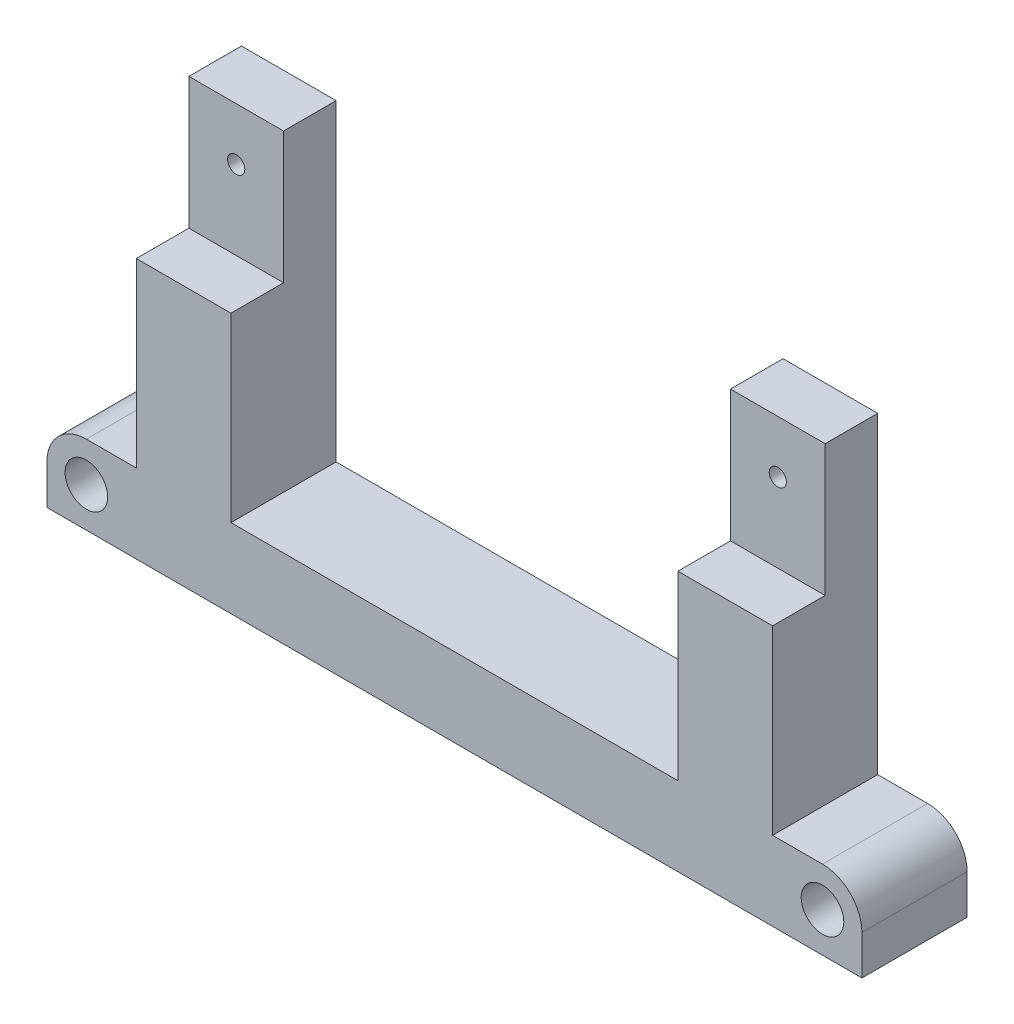
ISO-10303-21;
HEADER;
FILE_DESCRIPTION(('STEP AP214'),'2;1');
FILE_NAME('part.step','',(''),(''),'','','');
FILE_SCHEMA(('AUTOMOTIVE_DESIGN { 1 0 10303 214 1 1 1 1 }'));
ENDSEC;
DATA;
#1=APPLICATION_CONTEXT('core data for automotive mechanical design processes');
#2=APPLICATION_PROTOCOL_DEFINITION('international standard','automotive_design',2000,#1);
#3=PRODUCT_CONTEXT('',#1,'mechanical');
#4=PRODUCT('Part','Part','',(#3));
#5=PRODUCT_RELATED_PRODUCT_CATEGORY('part','',(#4));
#6=PRODUCT_DEFINITION_FORMATION('','',#4);
#7=PRODUCT_DEFINITION_CONTEXT('part definition',#1,'design');
#8=PRODUCT_DEFINITION('design','',#6,#7);
#9=PRODUCT_DEFINITION_SHAPE('','',#8);
#10=(LENGTH_UNIT() NAMED_UNIT(*) SI_UNIT(.MILLI.,.METRE.));
#11=(NAMED_UNIT(*) PLANE_ANGLE_UNIT() SI_UNIT($,.RADIAN.));
#12=(NAMED_UNIT(*) SI_UNIT($,.STERADIAN.) SOLID_ANGLE_UNIT());
#13=UNCERTAINTY_MEASURE_WITH_UNIT(LENGTH_MEASURE(1.E-05),#10,'distance_accuracy_value','');
#14=(GEOMETRIC_REPRESENTATION_CONTEXT(3) GLOBAL_UNCERTAINTY_ASSIGNED_CONTEXT((#13)) GLOBAL_UNIT_ASSIGNED_CONTEXT((#10,
#11,#12)) REPRESENTATION_CONTEXT('',''));
#15=CARTESIAN_POINT('',(0.,0.,0.));
#16=DIRECTION('',(0.,0.,1.));
#17=DIRECTION('',(1.,0.,0.));
#18=AXIS2_PLACEMENT_3D('',#15,#16,#17);
#19=CARTESIAN_POINT('',(-60.5,49.5,10.));
#20=DIRECTION('',(0.,-1.,0.));
#21=DIRECTION('',(1.,0.,0.));
#22=AXIS2_PLACEMENT_3D('',#19,#20,#21);
#23=PLANE('',#22);
#24=DIRECTION('',(1.,0.,0.));
#25=VECTOR('',#24,1.);
#26=CARTESIAN_POINT('',(-60.5,49.5,0.));
#27=LINE('',#26,#25);
#28=CARTESIAN_POINT('',(-60.5,49.5,0.));
#29=VERTEX_POINT('',#28);
#30=CARTESIAN_POINT('',(-42.5,49.5,0.));
#31=VERTEX_POINT('',#30);
#32=EDGE_CURVE('E308',#29,#31,#27,.T.);
#33=ORIENTED_EDGE('',*,*,#32,.F.);
#34=DIRECTION('',(0.,0.,-1.));
#35=VECTOR('',#34,1.);
#36=CARTESIAN_POINT('',(-60.5,49.5,10.));
#37=LINE('',#36,#35);
#38=CARTESIAN_POINT('',(-60.5,49.5,10.));
#39=VERTEX_POINT('',#38);
#40=EDGE_CURVE('E160',#39,#29,#37,.T.);
#41=ORIENTED_EDGE('',*,*,#40,.F.);
#42=DIRECTION('',(-1.,0.,0.));
#43=VECTOR('',#42,1.);
#44=CARTESIAN_POINT('',(-60.5,49.5,10.));
#45=LINE('',#44,#43);
#46=CARTESIAN_POINT('',(-42.5,49.5,10.));
#47=VERTEX_POINT('',#46);
#48=EDGE_CURVE('E148',#47,#39,#45,.T.);
#49=ORIENTED_EDGE('',*,*,#48,.F.);
#50=DIRECTION('',(0.,0.,-1.));
#51=VECTOR('',#50,1.);
#52=CARTESIAN_POINT('',(-42.5,49.5,10.));
#53=LINE('',#52,#51);
#54=EDGE_CURVE('E215',#47,#31,#53,.T.);
#55=ORIENTED_EDGE('',*,*,#54,.T.);
#56=EDGE_LOOP('',(#33,#41,#49,#55));
#57=FACE_BOUND('',#56,.T.);
#58=ADVANCED_FACE('F39',(#57),#23,.F.);
#59=CARTESIAN_POINT('',(42.5,49.5,10.));
#60=DIRECTION('',(0.,-1.,0.));
#61=DIRECTION('',(1.,0.,0.));
#62=AXIS2_PLACEMENT_3D('',#59,#60,#61);
#63=PLANE('',#62);
#64=DIRECTION('',(1.,0.,0.));
#65=VECTOR('',#64,1.);
#66=CARTESIAN_POINT('',(42.5,49.5,0.));
#67=LINE('',#66,#65);
#68=CARTESIAN_POINT('',(42.5,49.5,0.));
#69=VERTEX_POINT('',#68);
#70=CARTESIAN_POINT('',(60.5,49.5,0.));
#71=VERTEX_POINT('',#70);
#72=EDGE_CURVE('E372',#69,#71,#67,.T.);
#73=ORIENTED_EDGE('',*,*,#72,.F.);
#74=DIRECTION('',(0.,0.,-1.));
#75=VECTOR('',#74,1.);
#76=CARTESIAN_POINT('',(42.5,49.5,10.));
#77=LINE('',#76,#75);
#78=CARTESIAN_POINT('',(42.5,49.5,10.));
#79=VERTEX_POINT('',#78);
#80=EDGE_CURVE('E227',#79,#69,#77,.T.);
#81=ORIENTED_EDGE('',*,*,#80,.F.);
#82=DIRECTION('',(-1.,0.,0.));
#83=VECTOR('',#82,1.);
#84=CARTESIAN_POINT('',(42.5,49.5,10.));
#85=LINE('',#84,#83);
#86=CARTESIAN_POINT('',(60.5,49.5,10.));
#87=VERTEX_POINT('',#86);
#88=EDGE_CURVE('E277',#87,#79,#85,.T.);
#89=ORIENTED_EDGE('',*,*,#88,.F.);
#90=DIRECTION('',(0.,0.,-1.));
#91=VECTOR('',#90,1.);
#92=CARTESIAN_POINT('',(60.5,49.5,10.));
#93=LINE('',#92,#91);
#94=EDGE_CURVE('E231',#87,#71,#93,.T.);
#95=ORIENTED_EDGE('',*,*,#94,.T.);
#96=EDGE_LOOP('',(#73,#81,#89,#95));
#97=FACE_BOUND('',#96,.T.);
#98=ADVANCED_FACE('F426',(#97),#63,.F.);
#99=CARTESIAN_POINT('',(-70.,7.5,10.));
#100=DIRECTION('',(0.,0.,-1.));
#101=DIRECTION('',(-1.,0.,0.));
#102=AXIS2_PLACEMENT_3D('',#99,#100,#101);
#103=PLANE('',#102);
#104=DIRECTION('',(0.,-1.,0.));
#105=VECTOR('',#104,1.);
#106=CARTESIAN_POINT('',(-77.5,0.,10.));
#107=LINE('',#106,#105);
#108=CARTESIAN_POINT('',(-77.5,7.5,10.));
#109=VERTEX_POINT('',#108);
#110=CARTESIAN_POINT('',(-77.5,0.,10.));
#111=VERTEX_POINT('',#110);
#112=EDGE_CURVE('E208',#109,#111,#107,.T.);
#113=ORIENTED_EDGE('',*,*,#112,.T.);
#114=DIRECTION('',(1.,0.,0.));
#115=VECTOR('',#114,1.);
#116=CARTESIAN_POINT('',(-77.5,0.,10.));
#117=LINE('',#116,#115);
#118=CARTESIAN_POINT('',(77.5,0.,10.));
#119=VERTEX_POINT('',#118);
#120=EDGE_CURVE('E107',#111,#119,#117,.T.);
#121=ORIENTED_EDGE('',*,*,#120,.T.);
#122=DIRECTION('',(0.,1.,0.));
#123=VECTOR('',#122,1.);
#124=CARTESIAN_POINT('',(77.5,7.50000000000003,10.));
#125=LINE('',#124,#123);
#126=CARTESIAN_POINT('',(77.5,7.50000000000003,10.));
#127=VERTEX_POINT('',#126);
#128=EDGE_CURVE('E253',#119,#127,#125,.T.);
#129=ORIENTED_EDGE('',*,*,#128,.T.);
#130=CARTESIAN_POINT('',(70.,7.5,10.));
#131=DIRECTION('',(0.,0.,1.));
#132=DIRECTION('',(-1.,0.,0.));
#133=AXIS2_PLACEMENT_3D('',#130,#131,#132);
#134=CIRCLE('',#133,7.50000000000001);
#135=CARTESIAN_POINT('',(70.,15.,10.));
#136=VERTEX_POINT('',#135);
#137=EDGE_CURVE('E273',#127,#136,#134,.T.);
#138=ORIENTED_EDGE('',*,*,#137,.T.);
#139=DIRECTION('',(-1.,0.,0.));
#140=VECTOR('',#139,1.);
#141=CARTESIAN_POINT('',(60.5,15.,10.));
#142=LINE('',#141,#140);
#143=CARTESIAN_POINT('',(60.5,15.,10.));
#144=VERTEX_POINT('',#143);
#145=EDGE_CURVE('E269',#136,#144,#142,.T.);
#146=ORIENTED_EDGE('',*,*,#145,.T.);
#147=DIRECTION('',(0.,1.,0.));
#148=VECTOR('',#147,1.);
#149=CARTESIAN_POINT('',(60.5,49.5,10.));
#150=LINE('',#149,#148);
#151=EDGE_CURVE('E272',#144,#87,#150,.T.);
#152=ORIENTED_EDGE('',*,*,#151,.T.);
#153=ORIENTED_EDGE('',*,*,#88,.T.);
#154=DIRECTION('',(0.,-1.,0.));
#155=VECTOR('',#154,1.);
#156=CARTESIAN_POINT('',(42.5,15.,10.));
#157=LINE('',#156,#155);
#158=CARTESIAN_POINT('',(42.5,15.,10.));
#159=VERTEX_POINT('',#158);
#160=EDGE_CURVE('E284',#79,#159,#157,.T.);
#161=ORIENTED_EDGE('',*,*,#160,.T.);
#162=DIRECTION('',(-1.,0.,0.));
#163=VECTOR('',#162,1.);
#164=CARTESIAN_POINT('',(-42.5,15.,10.));
#165=LINE('',#164,#163);
#166=CARTESIAN_POINT('',(-42.5,15.,10.));
#167=VERTEX_POINT('',#166);
#168=EDGE_CURVE('E287',#159,#167,#165,.T.);
#169=ORIENTED_EDGE('',*,*,#168,.T.);
#170=DIRECTION('',(0.,1.,0.));
#171=VECTOR('',#170,1.);
#172=CARTESIAN_POINT('',(-42.5,49.5,10.));
#173=LINE('',#172,#171);
#174=EDGE_CURVE('E290',#167,#47,#173,.T.);
#175=ORIENTED_EDGE('',*,*,#174,.T.);
#176=ORIENTED_EDGE('',*,*,#48,.T.);
#177=DIRECTION('',(0.,-1.,0.));
#178=VECTOR('',#177,1.);
#179=CARTESIAN_POINT('',(-60.5,15.,10.));
#180=LINE('',#179,#178);
#181=CARTESIAN_POINT('',(-60.5,15.,10.));
#182=VERTEX_POINT('',#181);
#183=EDGE_CURVE('E141',#39,#182,#180,.T.);
#184=ORIENTED_EDGE('',*,*,#183,.T.);
#185=DIRECTION('',(-1.,0.,0.));
#186=VECTOR('',#185,1.);
#187=CARTESIAN_POINT('',(-70.,15.,10.));
#188=LINE('',#187,#186);
#189=CARTESIAN_POINT('',(-70.,15.,10.));
#190=VERTEX_POINT('',#189);
#191=EDGE_CURVE('E146',#182,#190,#188,.T.);
#192=ORIENTED_EDGE('',*,*,#191,.T.);
#193=CARTESIAN_POINT('',(-70.,7.5,10.));
#194=DIRECTION('',(0.,0.,1.));
#195=DIRECTION('',(-1.,0.,0.));
#196=AXIS2_PLACEMENT_3D('',#193,#194,#195);
#197=CIRCLE('',#196,7.5);
#198=EDGE_CURVE('E57',#190,#109,#197,.T.);
#199=ORIENTED_EDGE('',*,*,#198,.T.);
#200=EDGE_LOOP('',(#113,#121,#129,#138,#146,#152,#153,#161,#169,#175,#176,#184,#192,#199));
#201=FACE_BOUND('',#200,.T.);
#202=CARTESIAN_POINT('',(-70.,7.5,10.));
#203=DIRECTION('',(0.,0.,1.));
#204=DIRECTION('',(1.,0.,0.));
#205=AXIS2_PLACEMENT_3D('',#202,#203,#204);
#206=CIRCLE('',#205,4.05);
#207=CARTESIAN_POINT('',(-65.95,7.5,10.));
#208=VERTEX_POINT('',#207);
#209=EDGE_CURVE('E176',#208,#208,#206,.T.);
#210=ORIENTED_EDGE('',*,*,#209,.F.);
#211=EDGE_LOOP('',(#210));
#212=FACE_BOUND('',#211,.T.);
#213=CARTESIAN_POINT('',(70.,7.5,10.));
#214=DIRECTION('',(0.,0.,1.));
#215=DIRECTION('',(1.,0.,0.));
#216=AXIS2_PLACEMENT_3D('',#213,#214,#215);
#217=CIRCLE('',#216,4.05);
#218=CARTESIAN_POINT('',(74.05,7.5,10.));
#219=VERTEX_POINT('',#218);
#220=EDGE_CURVE('E397',#219,#219,#217,.T.);
#221=ORIENTED_EDGE('',*,*,#220,.F.);
#222=EDGE_LOOP('',(#221));
#223=FACE_BOUND('',#222,.T.);
#224=ADVANCED_FACE('F143',(#201,#212,#223),#103,.F.);
#225=CARTESIAN_POINT('',(-70.,7.5,-10.));
#226=DIRECTION('',(0.,0.,-1.));
#227=DIRECTION('',(-1.,0.,0.));
#228=AXIS2_PLACEMENT_3D('',#225,#226,#227);
#229=PLANE('',#228);
#230=CARTESIAN_POINT('',(-51.5,64.5,-10.));
#231=DIRECTION('',(0.,0.,1.));
#232=DIRECTION('',(1.,0.,0.));
#233=AXIS2_PLACEMENT_3D('',#230,#231,#232);
#234=CIRCLE('',#233,1.63195);
#235=CARTESIAN_POINT('',(-49.86805,64.5,-10.));
#236=VERTEX_POINT('',#235);
#237=EDGE_CURVE('E651',#236,#236,#234,.T.);
#238=ORIENTED_EDGE('',*,*,#237,.T.);
#239=EDGE_LOOP('',(#238));
#240=FACE_BOUND('',#239,.T.);
#241=CARTESIAN_POINT('',(51.5,64.5,-10.));
#242=DIRECTION('',(0.,0.,1.));
#243=DIRECTION('',(1.,0.,0.));
#244=AXIS2_PLACEMENT_3D('',#241,#242,#243);
#245=CIRCLE('',#244,1.63195);
#246=CARTESIAN_POINT('',(53.13195,64.5,-10.));
#247=VERTEX_POINT('',#246);
#248=EDGE_CURVE('E359',#247,#247,#245,.T.);
#249=ORIENTED_EDGE('',*,*,#248,.T.);
#250=EDGE_LOOP('',(#249));
#251=FACE_BOUND('',#250,.T.);
#252=CARTESIAN_POINT('',(-70.,7.5,-10.));
#253=DIRECTION('',(0.,0.,1.));
#254=DIRECTION('',(1.,0.,0.));
#255=AXIS2_PLACEMENT_3D('',#252,#253,#254);
#256=CIRCLE('',#255,4.05);
#257=CARTESIAN_POINT('',(-65.95,7.5,-10.));
#258=VERTEX_POINT('',#257);
#259=EDGE_CURVE('E401',#258,#258,#256,.T.);
#260=ORIENTED_EDGE('',*,*,#259,.T.);
#261=EDGE_LOOP('',(#260));
#262=FACE_BOUND('',#261,.T.);
#263=DIRECTION('',(0.,-1.,0.));
#264=VECTOR('',#263,1.);
#265=CARTESIAN_POINT('',(-77.5,0.,-10.));
#266=LINE('',#265,#264);
#267=CARTESIAN_POINT('',(-77.5,7.5,-10.));
#268=VERTEX_POINT('',#267);
#269=CARTESIAN_POINT('',(-77.5,0.,-10.));
#270=VERTEX_POINT('',#269);
#271=EDGE_CURVE('E171',#268,#270,#266,.T.);
#272=ORIENTED_EDGE('',*,*,#271,.F.);
#273=CARTESIAN_POINT('',(-70.,7.5,-10.));
#274=DIRECTION('',(0.,0.,1.));
#275=DIRECTION('',(-1.,0.,0.));
#276=AXIS2_PLACEMENT_3D('',#273,#274,#275);
#277=CIRCLE('',#276,7.5);
#278=CARTESIAN_POINT('',(-70.,15.,-10.));
#279=VERTEX_POINT('',#278);
#280=EDGE_CURVE('E99',#279,#268,#277,.T.);
#281=ORIENTED_EDGE('',*,*,#280,.F.);
#282=DIRECTION('',(-1.,0.,0.));
#283=VECTOR('',#282,1.);
#284=CARTESIAN_POINT('',(-70.,15.,-10.));
#285=LINE('',#284,#283);
#286=CARTESIAN_POINT('',(-60.5,15.,-10.));
#287=VERTEX_POINT('',#286);
#288=EDGE_CURVE('E93',#287,#279,#285,.T.);
#289=ORIENTED_EDGE('',*,*,#288,.F.);
#290=DIRECTION('',(0.,-1.,0.));
#291=VECTOR('',#290,1.);
#292=CARTESIAN_POINT('',(-60.5,15.,-10.));
#293=LINE('',#292,#291);
#294=CARTESIAN_POINT('',(-60.5,74.5,-10.));
#295=VERTEX_POINT('',#294);
#296=EDGE_CURVE('E158',#295,#287,#293,.T.);
#297=ORIENTED_EDGE('',*,*,#296,.F.);
#298=DIRECTION('',(-1.,0.,0.));
#299=VECTOR('',#298,1.);
#300=CARTESIAN_POINT('',(-60.5,74.5,-10.));
#301=LINE('',#300,#299);
#302=CARTESIAN_POINT('',(-42.5,74.5,-10.));
#303=VERTEX_POINT('',#302);
#304=EDGE_CURVE('E355',#303,#295,#301,.T.);
#305=ORIENTED_EDGE('',*,*,#304,.F.);
#306=DIRECTION('',(0.,1.,0.));
#307=VECTOR('',#306,1.);
#308=CARTESIAN_POINT('',(-42.5,49.5,-10.));
#309=LINE('',#308,#307);
#310=CARTESIAN_POINT('',(-42.5,15.,-10.));
#311=VERTEX_POINT('',#310);
#312=EDGE_CURVE('E198',#311,#303,#309,.T.);
#313=ORIENTED_EDGE('',*,*,#312,.F.);
#314=DIRECTION('',(-1.,0.,0.));
#315=VECTOR('',#314,1.);
#316=CARTESIAN_POINT('',(-42.5,15.,-10.));
#317=LINE('',#316,#315);
#318=CARTESIAN_POINT('',(42.5,15.,-10.));
#319=VERTEX_POINT('',#318);
#320=EDGE_CURVE('E195',#319,#311,#317,.T.);
#321=ORIENTED_EDGE('',*,*,#320,.F.);
#322=DIRECTION('',(0.,-1.,0.));
#323=VECTOR('',#322,1.);
#324=CARTESIAN_POINT('',(42.5,15.,-10.));
#325=LINE('',#324,#323);
#326=CARTESIAN_POINT('',(42.5,74.5,-10.));
#327=VERTEX_POINT('',#326);
#328=EDGE_CURVE('E192',#327,#319,#325,.T.);
#329=ORIENTED_EDGE('',*,*,#328,.F.);
#330=DIRECTION('',(-1.,0.,0.));
#331=VECTOR('',#330,1.);
#332=CARTESIAN_POINT('',(42.5,74.5,-10.));
#333=LINE('',#332,#331);
#334=CARTESIAN_POINT('',(60.5,74.5,-10.));
#335=VERTEX_POINT('',#334);
#336=EDGE_CURVE('E384',#335,#327,#333,.T.);
#337=ORIENTED_EDGE('',*,*,#336,.F.);
#338=DIRECTION('',(0.,1.,0.));
#339=VECTOR('',#338,1.);
#340=CARTESIAN_POINT('',(60.5,49.5,-10.));
#341=LINE('',#340,#339);
#342=CARTESIAN_POINT('',(60.5,15.,-10.));
#343=VERTEX_POINT('',#342);
#344=EDGE_CURVE('E188',#343,#335,#341,.T.);
#345=ORIENTED_EDGE('',*,*,#344,.F.);
#346=DIRECTION('',(-1.,0.,0.));
#347=VECTOR('',#346,1.);
#348=CARTESIAN_POINT('',(60.5,15.,-10.));
#349=LINE('',#348,#347);
#350=CARTESIAN_POINT('',(70.,15.,-10.));
#351=VERTEX_POINT('',#350);
#352=EDGE_CURVE('E185',#351,#343,#349,.T.);
#353=ORIENTED_EDGE('',*,*,#352,.F.);
#354=CARTESIAN_POINT('',(70.,7.5,-10.));
#355=DIRECTION('',(0.,0.,1.));
#356=DIRECTION('',(-1.,0.,0.));
#357=AXIS2_PLACEMENT_3D('',#354,#355,#356);
#358=CIRCLE('',#357,7.50000000000001);
#359=CARTESIAN_POINT('',(77.5,7.50000000000003,-10.));
#360=VERTEX_POINT('',#359);
#361=EDGE_CURVE('E182',#360,#351,#358,.T.);
#362=ORIENTED_EDGE('',*,*,#361,.F.);
#363=DIRECTION('',(0.,1.,0.));
#364=VECTOR('',#363,1.);
#365=CARTESIAN_POINT('',(77.5,7.50000000000003,-10.));
#366=LINE('',#365,#364);
#367=CARTESIAN_POINT('',(77.5,0.,-10.));
#368=VERTEX_POINT('',#367);
#369=EDGE_CURVE('E179',#368,#360,#366,.T.);
#370=ORIENTED_EDGE('',*,*,#369,.F.);
#371=DIRECTION('',(1.,0.,0.));
#372=VECTOR('',#371,1.);
#373=CARTESIAN_POINT('',(-77.5,0.,-10.));
#374=LINE('',#373,#372);
#375=EDGE_CURVE('E175',#270,#368,#374,.T.);
#376=ORIENTED_EDGE('',*,*,#375,.F.);
#377=EDGE_LOOP('',(#272,#281,#289,#297,#305,#313,#321,#329,#337,#345,#353,#362,#370,#376));
#378=FACE_BOUND('',#377,.T.);
#379=CARTESIAN_POINT('',(70.,7.5,-10.));
#380=DIRECTION('',(0.,0.,1.));
#381=DIRECTION('',(1.,0.,0.));
#382=AXIS2_PLACEMENT_3D('',#379,#380,#381);
#383=CIRCLE('',#382,4.05);
#384=CARTESIAN_POINT('',(74.05,7.5,-10.));
#385=VERTEX_POINT('',#384);
#386=EDGE_CURVE('E396',#385,#385,#383,.T.);
#387=ORIENTED_EDGE('',*,*,#386,.T.);
#388=EDGE_LOOP('',(#387));
#389=FACE_BOUND('',#388,.T.);
#390=ADVANCED_FACE('F257',(#240,#251,#262,#378,#389),#229,.T.);
#391=CARTESIAN_POINT('',(-77.5,0.,10.));
#392=DIRECTION('',(1.,0.,0.));
#393=DIRECTION('',(0.,1.,0.));
#394=AXIS2_PLACEMENT_3D('',#391,#392,#393);
#395=PLANE('',#394);
#396=ORIENTED_EDGE('',*,*,#271,.T.);
#397=DIRECTION('',(0.,0.,-1.));
#398=VECTOR('',#397,1.);
#399=CARTESIAN_POINT('',(-77.5,0.,10.));
#400=LINE('',#399,#398);
#401=EDGE_CURVE('E11',#111,#270,#400,.T.);
#402=ORIENTED_EDGE('',*,*,#401,.F.);
#403=ORIENTED_EDGE('',*,*,#112,.F.);
#404=DIRECTION('',(0.,0.,-1.));
#405=VECTOR('',#404,1.);
#406=CARTESIAN_POINT('',(-77.5,7.5,10.));
#407=LINE('',#406,#405);
#408=EDGE_CURVE('E167',#109,#268,#407,.T.);
#409=ORIENTED_EDGE('',*,*,#408,.T.);
#410=EDGE_LOOP('',(#396,#402,#403,#409));
#411=FACE_BOUND('',#410,.T.);
#412=ADVANCED_FACE('F41',(#411),#395,.F.);
#413=CARTESIAN_POINT('',(-77.5,0.,10.));
#414=DIRECTION('',(0.,1.,0.));
#415=DIRECTION('',(-1.,0.,0.));
#416=AXIS2_PLACEMENT_3D('',#413,#414,#415);
#417=PLANE('',#416);
#418=ORIENTED_EDGE('',*,*,#375,.T.);
#419=DIRECTION('',(0.,0.,-1.));
#420=VECTOR('',#419,1.);
#421=CARTESIAN_POINT('',(77.5,0.,10.));
#422=LINE('',#421,#420);
#423=EDGE_CURVE('E49',#119,#368,#422,.T.);
#424=ORIENTED_EDGE('',*,*,#423,.F.);
#425=ORIENTED_EDGE('',*,*,#120,.F.);
#426=ORIENTED_EDGE('',*,*,#401,.T.);
#427=EDGE_LOOP('',(#418,#424,#425,#426));
#428=FACE_BOUND('',#427,.T.);
#429=ADVANCED_FACE('F418',(#428),#417,.F.);
#430=CARTESIAN_POINT('',(77.5,7.50000000000003,10.));
#431=DIRECTION('',(-1.,0.,0.));
#432=DIRECTION('',(0.,-1.,0.));
#433=AXIS2_PLACEMENT_3D('',#430,#431,#432);
#434=PLANE('',#433);
#435=ORIENTED_EDGE('',*,*,#369,.T.);
#436=DIRECTION('',(0.,0.,-1.));
#437=VECTOR('',#436,1.);
#438=CARTESIAN_POINT('',(77.5,7.50000000000003,10.));
#439=LINE('',#438,#437);
#440=EDGE_CURVE('E243',#127,#360,#439,.T.);
#441=ORIENTED_EDGE('',*,*,#440,.F.);
#442=ORIENTED_EDGE('',*,*,#128,.F.);
#443=ORIENTED_EDGE('',*,*,#423,.T.);
#444=EDGE_LOOP('',(#435,#441,#442,#443));
#445=FACE_BOUND('',#444,.T.);
#446=ADVANCED_FACE('F251',(#445),#434,.F.);
#447=CARTESIAN_POINT('',(70.,7.5,10.));
#448=DIRECTION('',(0.,0.,-1.));
#449=DIRECTION('',(-1.,0.,0.));
#450=AXIS2_PLACEMENT_3D('',#447,#448,#449);
#451=CYLINDRICAL_SURFACE('',#450,7.50000000000001);
#452=ORIENTED_EDGE('',*,*,#361,.T.);
#453=DIRECTION('',(0.,0.,-1.));
#454=VECTOR('',#453,1.);
#455=CARTESIAN_POINT('',(70.,15.,10.));
#456=LINE('',#455,#454);
#457=EDGE_CURVE('E239',#136,#351,#456,.T.);
#458=ORIENTED_EDGE('',*,*,#457,.F.);
#459=ORIENTED_EDGE('',*,*,#137,.F.);
#460=ORIENTED_EDGE('',*,*,#440,.T.);
#461=EDGE_LOOP('',(#452,#458,#459,#460));
#462=FACE_BOUND('',#461,.T.);
#463=ADVANCED_FACE('F263',(#462),#451,.T.);
#464=CARTESIAN_POINT('',(60.5,15.,10.));
#465=DIRECTION('',(0.,-1.,0.));
#466=DIRECTION('',(1.,0.,0.));
#467=AXIS2_PLACEMENT_3D('',#464,#465,#466);
#468=PLANE('',#467);
#469=ORIENTED_EDGE('',*,*,#352,.T.);
#470=DIRECTION('',(0.,0.,-1.));
#471=VECTOR('',#470,1.);
#472=CARTESIAN_POINT('',(60.5,15.,10.));
#473=LINE('',#472,#471);
#474=EDGE_CURVE('E235',#144,#343,#473,.T.);
#475=ORIENTED_EDGE('',*,*,#474,.F.);
#476=ORIENTED_EDGE('',*,*,#145,.F.);
#477=ORIENTED_EDGE('',*,*,#457,.T.);
#478=EDGE_LOOP('',(#469,#475,#476,#477));
#479=FACE_BOUND('',#478,.T.);
#480=ADVANCED_FACE('F267',(#479),#468,.F.);
#481=CARTESIAN_POINT('',(60.5,49.5,10.));
#482=DIRECTION('',(-1.,0.,0.));
#483=DIRECTION('',(0.,-1.,0.));
#484=AXIS2_PLACEMENT_3D('',#481,#482,#483);
#485=PLANE('',#484);
#486=ORIENTED_EDGE('',*,*,#344,.T.);
#487=DIRECTION('',(0.,0.,-1.));
#488=VECTOR('',#487,1.);
#489=CARTESIAN_POINT('',(60.5,74.5,-10.));
#490=LINE('',#489,#488);
#491=CARTESIAN_POINT('',(60.5,74.5,0.));
#492=VERTEX_POINT('',#491);
#493=EDGE_CURVE('E380',#492,#335,#490,.T.);
#494=ORIENTED_EDGE('',*,*,#493,.F.);
#495=DIRECTION('',(0.,-1.,0.));
#496=VECTOR('',#495,1.);
#497=CARTESIAN_POINT('',(60.5,74.5,0.));
#498=LINE('',#497,#496);
#499=EDGE_CURVE('E388',#492,#71,#498,.T.);
#500=ORIENTED_EDGE('',*,*,#499,.T.);
#501=ORIENTED_EDGE('',*,*,#94,.F.);
#502=ORIENTED_EDGE('',*,*,#151,.F.);
#503=ORIENTED_EDGE('',*,*,#474,.T.);
#504=EDGE_LOOP('',(#486,#494,#500,#501,#502,#503));
#505=FACE_BOUND('',#504,.T.);
#506=ADVANCED_FACE('F444',(#505),#485,.F.);
#507=CARTESIAN_POINT('',(42.5,15.,10.));
#508=DIRECTION('',(1.,0.,0.));
#509=DIRECTION('',(0.,1.,0.));
#510=AXIS2_PLACEMENT_3D('',#507,#508,#509);
#511=PLANE('',#510);
#512=ORIENTED_EDGE('',*,*,#328,.T.);
#513=DIRECTION('',(0.,0.,-1.));
#514=VECTOR('',#513,1.);
#515=CARTESIAN_POINT('',(42.5,15.,10.));
#516=LINE('',#515,#514);
#517=EDGE_CURVE('E223',#159,#319,#516,.T.);
#518=ORIENTED_EDGE('',*,*,#517,.F.);
#519=ORIENTED_EDGE('',*,*,#160,.F.);
#520=ORIENTED_EDGE('',*,*,#80,.T.);
#521=DIRECTION('',(0.,-1.,0.));
#522=VECTOR('',#521,1.);
#523=CARTESIAN_POINT('',(42.5,74.5,0.));
#524=LINE('',#523,#522);
#525=CARTESIAN_POINT('',(42.5,74.5,0.));
#526=VERTEX_POINT('',#525);
#527=EDGE_CURVE('E335',#526,#69,#524,.T.);
#528=ORIENTED_EDGE('',*,*,#527,.F.);
#529=DIRECTION('',(0.,0.,1.));
#530=VECTOR('',#529,1.);
#531=CARTESIAN_POINT('',(42.5,74.5,-10.));
#532=LINE('',#531,#530);
#533=EDGE_CURVE('E373',#327,#526,#532,.T.);
#534=ORIENTED_EDGE('',*,*,#533,.F.);
#535=EDGE_LOOP('',(#512,#518,#519,#520,#528,#534));
#536=FACE_BOUND('',#535,.T.);
#537=ADVANCED_FACE('F441',(#536),#511,.F.);
#538=CARTESIAN_POINT('',(-42.5,15.,10.));
#539=DIRECTION('',(0.,-1.,0.));
#540=DIRECTION('',(1.,0.,0.));
#541=AXIS2_PLACEMENT_3D('',#538,#539,#540);
#542=PLANE('',#541);
#543=ORIENTED_EDGE('',*,*,#320,.T.);
#544=DIRECTION('',(0.,0.,-1.));
#545=VECTOR('',#544,1.);
#546=CARTESIAN_POINT('',(-42.5,15.,10.));
#547=LINE('',#546,#545);
#548=EDGE_CURVE('E219',#167,#311,#547,.T.);
#549=ORIENTED_EDGE('',*,*,#548,.F.);
#550=ORIENTED_EDGE('',*,*,#168,.F.);
#551=ORIENTED_EDGE('',*,*,#517,.T.);
#552=EDGE_LOOP('',(#543,#549,#550,#551));
#553=FACE_BOUND('',#552,.T.);
#554=ADVANCED_FACE('F438',(#553),#542,.F.);
#555=CARTESIAN_POINT('',(-42.5,49.5,10.));
#556=DIRECTION('',(-1.,0.,0.));
#557=DIRECTION('',(0.,-1.,0.));
#558=AXIS2_PLACEMENT_3D('',#555,#556,#557);
#559=PLANE('',#558);
#560=ORIENTED_EDGE('',*,*,#312,.T.);
#561=DIRECTION('',(0.,0.,-1.));
#562=VECTOR('',#561,1.);
#563=CARTESIAN_POINT('',(-42.5,74.5,-10.));
#564=LINE('',#563,#562);
#565=CARTESIAN_POINT('',(-42.5,74.5,0.));
#566=VERTEX_POINT('',#565);
#567=EDGE_CURVE('E351',#566,#303,#564,.T.);
#568=ORIENTED_EDGE('',*,*,#567,.F.);
#569=DIRECTION('',(0.,-1.,0.));
#570=VECTOR('',#569,1.);
#571=CARTESIAN_POINT('',(-42.5,74.5,0.));
#572=LINE('',#571,#570);
#573=EDGE_CURVE('E303',#566,#31,#572,.T.);
#574=ORIENTED_EDGE('',*,*,#573,.T.);
#575=ORIENTED_EDGE('',*,*,#54,.F.);
#576=ORIENTED_EDGE('',*,*,#174,.F.);
#577=ORIENTED_EDGE('',*,*,#548,.T.);
#578=EDGE_LOOP('',(#560,#568,#574,#575,#576,#577));
#579=FACE_BOUND('',#578,.T.);
#580=ADVANCED_FACE('F299',(#579),#559,.F.);
#581=CARTESIAN_POINT('',(-60.5,15.,10.));
#582=DIRECTION('',(1.,0.,0.));
#583=DIRECTION('',(0.,1.,0.));
#584=AXIS2_PLACEMENT_3D('',#581,#582,#583);
#585=PLANE('',#584);
#586=ORIENTED_EDGE('',*,*,#296,.T.);
#587=DIRECTION('',(0.,0.,-1.));
#588=VECTOR('',#587,1.);
#589=CARTESIAN_POINT('',(-60.5,15.,10.));
#590=LINE('',#589,#588);
#591=EDGE_CURVE('E154',#182,#287,#590,.T.);
#592=ORIENTED_EDGE('',*,*,#591,.F.);
#593=ORIENTED_EDGE('',*,*,#183,.F.);
#594=ORIENTED_EDGE('',*,*,#40,.T.);
#595=DIRECTION('',(0.,-1.,0.));
#596=VECTOR('',#595,1.);
#597=CARTESIAN_POINT('',(-60.5,74.5,0.));
#598=LINE('',#597,#596);
#599=CARTESIAN_POINT('',(-60.5,74.5,0.));
#600=VERTEX_POINT('',#599);
#601=EDGE_CURVE('E312',#600,#29,#598,.T.);
#602=ORIENTED_EDGE('',*,*,#601,.F.);
#603=DIRECTION('',(0.,0.,1.));
#604=VECTOR('',#603,1.);
#605=CARTESIAN_POINT('',(-60.5,74.5,-10.));
#606=LINE('',#605,#604);
#607=EDGE_CURVE('E352',#295,#600,#606,.T.);
#608=ORIENTED_EDGE('',*,*,#607,.F.);
#609=EDGE_LOOP('',(#586,#592,#593,#594,#602,#608));
#610=FACE_BOUND('',#609,.T.);
#611=ADVANCED_FACE('F155',(#610),#585,.F.);
#612=CARTESIAN_POINT('',(-70.,15.,10.));
#613=DIRECTION('',(0.,-1.,0.));
#614=DIRECTION('',(0.,0.,-1.));
#615=AXIS2_PLACEMENT_3D('',#612,#613,#614);
#616=PLANE('',#615);
#617=ORIENTED_EDGE('',*,*,#288,.T.);
#618=DIRECTION('',(0.,0.,-1.));
#619=VECTOR('',#618,1.);
#620=CARTESIAN_POINT('',(-70.,15.,10.));
#621=LINE('',#620,#619);
#622=EDGE_CURVE('E161',#190,#279,#621,.T.);
#623=ORIENTED_EDGE('',*,*,#622,.F.);
#624=ORIENTED_EDGE('',*,*,#191,.F.);
#625=ORIENTED_EDGE('',*,*,#591,.T.);
#626=EDGE_LOOP('',(#617,#623,#624,#625));
#627=FACE_BOUND('',#626,.T.);
#628=ADVANCED_FACE('F163',(#627),#616,.F.);
#629=CARTESIAN_POINT('',(-70.,7.5,10.));
#630=DIRECTION('',(0.,0.,-1.));
#631=DIRECTION('',(-1.,0.,0.));
#632=AXIS2_PLACEMENT_3D('',#629,#630,#631);
#633=CYLINDRICAL_SURFACE('',#632,7.5);
#634=ORIENTED_EDGE('',*,*,#280,.T.);
#635=ORIENTED_EDGE('',*,*,#408,.F.);
#636=ORIENTED_EDGE('',*,*,#198,.F.);
#637=ORIENTED_EDGE('',*,*,#622,.T.);
#638=EDGE_LOOP('',(#634,#635,#636,#637));
#639=FACE_BOUND('',#638,.T.);
#640=ADVANCED_FACE('F490',(#639),#633,.T.);
#641=CARTESIAN_POINT('',(-70.,7.5,10.));
#642=DIRECTION('',(0.,0.,-1.));
#643=DIRECTION('',(-1.,0.,0.));
#644=AXIS2_PLACEMENT_3D('',#641,#642,#643);
#645=CYLINDRICAL_SURFACE('',#644,4.05);
#646=ORIENTED_EDGE('',*,*,#209,.T.);
#647=EDGE_LOOP('',(#646));
#648=FACE_BOUND('',#647,.T.);
#649=ORIENTED_EDGE('',*,*,#259,.F.);
#650=EDGE_LOOP('',(#649));
#651=FACE_BOUND('',#650,.T.);
#652=ADVANCED_FACE('F496',(#648,#651),#645,.F.);
#653=CARTESIAN_POINT('',(70.,7.5,10.));
#654=DIRECTION('',(0.,0.,-1.));
#655=DIRECTION('',(-1.,0.,0.));
#656=AXIS2_PLACEMENT_3D('',#653,#654,#655);
#657=CYLINDRICAL_SURFACE('',#656,4.05);
#658=ORIENTED_EDGE('',*,*,#220,.T.);
#659=EDGE_LOOP('',(#658));
#660=FACE_BOUND('',#659,.T.);
#661=ORIENTED_EDGE('',*,*,#386,.F.);
#662=EDGE_LOOP('',(#661));
#663=FACE_BOUND('',#662,.T.);
#664=ADVANCED_FACE('F503',(#660,#663),#657,.F.);
#665=CARTESIAN_POINT('',(42.5,74.5,0.));
#666=DIRECTION('',(0.,0.,-1.));
#667=DIRECTION('',(-1.,0.,0.));
#668=AXIS2_PLACEMENT_3D('',#665,#666,#667);
#669=PLANE('',#668);
#670=CARTESIAN_POINT('',(51.5,64.5,0.));
#671=DIRECTION('',(0.,0.,1.));
#672=DIRECTION('',(1.,0.,0.));
#673=AXIS2_PLACEMENT_3D('',#670,#671,#672);
#674=CIRCLE('',#673,1.63195);
#675=CARTESIAN_POINT('',(53.13195,64.5,0.));
#676=VERTEX_POINT('',#675);
#677=EDGE_CURVE('E658',#676,#676,#674,.T.);
#678=ORIENTED_EDGE('',*,*,#677,.F.);
#679=EDGE_LOOP('',(#678));
#680=FACE_BOUND('',#679,.T.);
#681=ORIENTED_EDGE('',*,*,#72,.T.);
#682=ORIENTED_EDGE('',*,*,#499,.F.);
#683=DIRECTION('',(1.,0.,0.));
#684=VECTOR('',#683,1.);
#685=CARTESIAN_POINT('',(42.5,74.5,0.));
#686=LINE('',#685,#684);
#687=EDGE_CURVE('E377',#526,#492,#686,.T.);
#688=ORIENTED_EDGE('',*,*,#687,.F.);
#689=ORIENTED_EDGE('',*,*,#527,.T.);
#690=EDGE_LOOP('',(#681,#682,#688,#689));
#691=FACE_BOUND('',#690,.T.);
#692=ADVANCED_FACE('F511',(#680,#691),#669,.F.);
#693=CARTESIAN_POINT('',(0.,74.5,0.));
#694=DIRECTION('',(0.,1.,0.));
#695=DIRECTION('',(-1.,0.,0.));
#696=AXIS2_PLACEMENT_3D('',#693,#694,#695);
#697=PLANE('',#696);
#698=ORIENTED_EDGE('',*,*,#533,.T.);
#699=ORIENTED_EDGE('',*,*,#687,.T.);
#700=ORIENTED_EDGE('',*,*,#493,.T.);
#701=ORIENTED_EDGE('',*,*,#336,.T.);
#702=EDGE_LOOP('',(#698,#699,#700,#701));
#703=FACE_BOUND('',#702,.T.);
#704=ADVANCED_FACE('F519',(#703),#697,.T.);
#705=CARTESIAN_POINT('',(-60.5,74.5,0.));
#706=DIRECTION('',(0.,0.,-1.));
#707=DIRECTION('',(-1.,0.,0.));
#708=AXIS2_PLACEMENT_3D('',#705,#706,#707);
#709=PLANE('',#708);
#710=CARTESIAN_POINT('',(-51.5,64.5,0.));
#711=DIRECTION('',(0.,0.,1.));
#712=DIRECTION('',(1.,0.,0.));
#713=AXIS2_PLACEMENT_3D('',#710,#711,#712);
#714=CIRCLE('',#713,1.63195);
#715=CARTESIAN_POINT('',(-49.86805,64.5,0.));
#716=VERTEX_POINT('',#715);
#717=EDGE_CURVE('E664',#716,#716,#714,.T.);
#718=ORIENTED_EDGE('',*,*,#717,.F.);
#719=EDGE_LOOP('',(#718));
#720=FACE_BOUND('',#719,.T.);
#721=ORIENTED_EDGE('',*,*,#32,.T.);
#722=ORIENTED_EDGE('',*,*,#573,.F.);
#723=DIRECTION('',(1.,0.,0.));
#724=VECTOR('',#723,1.);
#725=CARTESIAN_POINT('',(-60.5,74.5,0.));
#726=LINE('',#725,#724);
#727=EDGE_CURVE('E346',#600,#566,#726,.T.);
#728=ORIENTED_EDGE('',*,*,#727,.F.);
#729=ORIENTED_EDGE('',*,*,#601,.T.);
#730=EDGE_LOOP('',(#721,#722,#728,#729));
#731=FACE_BOUND('',#730,.T.);
#732=ADVANCED_FACE('F348',(#720,#731),#709,.F.);
#733=CARTESIAN_POINT('',(0.,74.5,0.));
#734=DIRECTION('',(0.,1.,0.));
#735=DIRECTION('',(-1.,0.,0.));
#736=AXIS2_PLACEMENT_3D('',#733,#734,#735);
#737=PLANE('',#736);
#738=ORIENTED_EDGE('',*,*,#607,.T.);
#739=ORIENTED_EDGE('',*,*,#727,.T.);
#740=ORIENTED_EDGE('',*,*,#567,.T.);
#741=ORIENTED_EDGE('',*,*,#304,.T.);
#742=EDGE_LOOP('',(#738,#739,#740,#741));
#743=FACE_BOUND('',#742,.T.);
#744=ADVANCED_FACE('F354',(#743),#737,.T.);
#745=CARTESIAN_POINT('',(51.5,64.5,0.));
#746=DIRECTION('',(0.,0.,1.));
#747=DIRECTION('',(1.,0.,0.));
#748=AXIS2_PLACEMENT_3D('',#745,#746,#747);
#749=CYLINDRICAL_SURFACE('',#748,1.63195);
#750=ORIENTED_EDGE('',*,*,#248,.F.);
#751=EDGE_LOOP('',(#750));
#752=FACE_BOUND('',#751,.T.);
#753=ORIENTED_EDGE('',*,*,#677,.T.);
#754=EDGE_LOOP('',(#753));
#755=FACE_BOUND('',#754,.T.);
#756=ADVANCED_FACE('F542',(#752,#755),#749,.F.);
#757=CARTESIAN_POINT('',(-51.5,64.5,0.));
#758=DIRECTION('',(0.,0.,1.));
#759=DIRECTION('',(1.,0.,0.));
#760=AXIS2_PLACEMENT_3D('',#757,#758,#759);
#761=CYLINDRICAL_SURFACE('',#760,1.63195);
#762=ORIENTED_EDGE('',*,*,#237,.F.);
#763=EDGE_LOOP('',(#762));
#764=FACE_BOUND('',#763,.T.);
#765=ORIENTED_EDGE('',*,*,#717,.T.);
#766=EDGE_LOOP('',(#765));
#767=FACE_BOUND('',#766,.T.);
#768=ADVANCED_FACE('F548',(#764,#767),#761,.F.);
#769=CLOSED_SHELL('',(#58,#98,#224,#390,#412,#429,#446,#463,#480,#506,#537,#554,#580,#611,#628,
#640,#652,#664,#692,#704,#732,#744,#756,#768));
#770=MANIFOLD_SOLID_BREP('B2',#769);
#771=ADVANCED_BREP_SHAPE_REPRESENTATION('',(#18,#770),#14);
#772=SHAPE_DEFINITION_REPRESENTATION(#9,#771);
ENDSEC;
END-ISO-10303-21;
